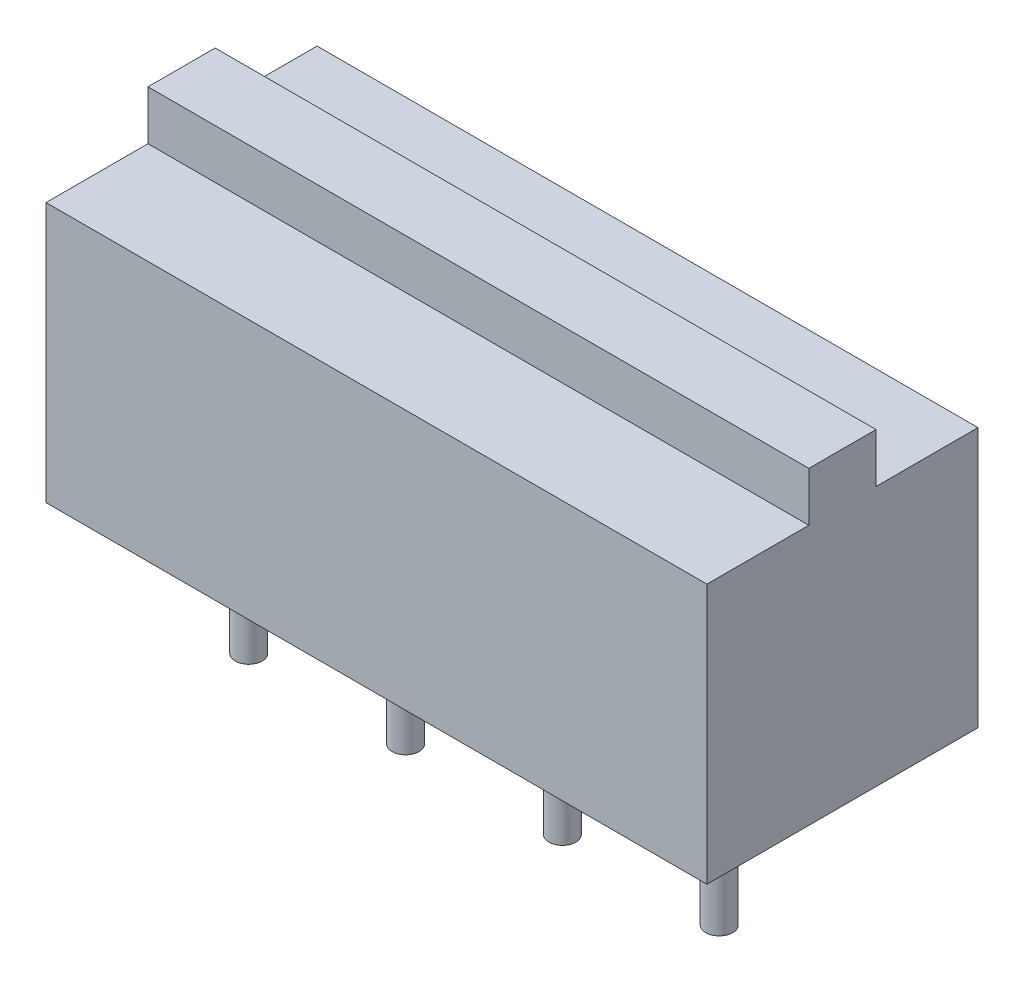
ISO-10303-21;
HEADER;
FILE_DESCRIPTION(('STEP AP214'),'2;1');
FILE_NAME('part.step','',(''),(''),'','','');
FILE_SCHEMA(('AUTOMOTIVE_DESIGN { 1 0 10303 214 1 1 1 1 }'));
ENDSEC;
DATA;
#1=APPLICATION_CONTEXT('core data for automotive mechanical design processes');
#2=APPLICATION_PROTOCOL_DEFINITION('international standard','automotive_design',2000,#1);
#3=PRODUCT_CONTEXT('',#1,'mechanical');
#4=PRODUCT('Part','Part','',(#3));
#5=PRODUCT_RELATED_PRODUCT_CATEGORY('part','',(#4));
#6=PRODUCT_DEFINITION_FORMATION('','',#4);
#7=PRODUCT_DEFINITION_CONTEXT('part definition',#1,'design');
#8=PRODUCT_DEFINITION('design','',#6,#7);
#9=PRODUCT_DEFINITION_SHAPE('','',#8);
#10=(LENGTH_UNIT() NAMED_UNIT(*) SI_UNIT(.MILLI.,.METRE.));
#11=(NAMED_UNIT(*) PLANE_ANGLE_UNIT() SI_UNIT($,.RADIAN.));
#12=(NAMED_UNIT(*) SI_UNIT($,.STERADIAN.) SOLID_ANGLE_UNIT());
#13=UNCERTAINTY_MEASURE_WITH_UNIT(LENGTH_MEASURE(1.E-05),#10,'distance_accuracy_value','');
#14=(GEOMETRIC_REPRESENTATION_CONTEXT(3) GLOBAL_UNCERTAINTY_ASSIGNED_CONTEXT((#13)) GLOBAL_UNIT_ASSIGNED_CONTEXT((#10,
#11,#12)) REPRESENTATION_CONTEXT('',''));
#15=CARTESIAN_POINT('',(0.,0.,0.));
#16=DIRECTION('',(0.,0.,1.));
#17=DIRECTION('',(1.,0.,0.));
#18=AXIS2_PLACEMENT_3D('',#15,#16,#17);
#19=CARTESIAN_POINT('',(0.,11.6,0.));
#20=DIRECTION('',(0.,-1.,0.));
#21=DIRECTION('',(0.,0.,-1.));
#22=AXIS2_PLACEMENT_3D('',#19,#20,#21);
#23=PLANE('',#22);
#24=DIRECTION('',(1.,0.,0.));
#25=VECTOR('',#24,1.);
#26=CARTESIAN_POINT('',(-14.75,11.6,1.5));
#27=LINE('',#26,#25);
#28=CARTESIAN_POINT('',(-14.75,11.6,1.5));
#29=VERTEX_POINT('',#28);
#30=CARTESIAN_POINT('',(14.75,11.6,1.5));
#31=VERTEX_POINT('',#30);
#32=EDGE_CURVE('E55',#29,#31,#27,.T.);
#33=ORIENTED_EDGE('',*,*,#32,.F.);
#34=DIRECTION('',(0.,0.,1.));
#35=VECTOR('',#34,1.);
#36=CARTESIAN_POINT('',(-14.75,11.6,6.05));
#37=LINE('',#36,#35);
#38=CARTESIAN_POINT('',(-14.75,11.6,6.05));
#39=VERTEX_POINT('',#38);
#40=EDGE_CURVE('E147',#29,#39,#37,.T.);
#41=ORIENTED_EDGE('',*,*,#40,.T.);
#42=DIRECTION('',(1.,0.,0.));
#43=VECTOR('',#42,1.);
#44=CARTESIAN_POINT('',(-14.75,11.6,6.05));
#45=LINE('',#44,#43);
#46=CARTESIAN_POINT('',(14.75,11.6,6.05));
#47=VERTEX_POINT('',#46);
#48=EDGE_CURVE('E151',#39,#47,#45,.T.);
#49=ORIENTED_EDGE('',*,*,#48,.T.);
#50=DIRECTION('',(0.,0.,-1.));
#51=VECTOR('',#50,1.);
#52=CARTESIAN_POINT('',(14.75,11.6,6.05));
#53=LINE('',#52,#51);
#54=EDGE_CURVE('E141',#47,#31,#53,.T.);
#55=ORIENTED_EDGE('',*,*,#54,.T.);
#56=EDGE_LOOP('',(#33,#41,#49,#55));
#57=FACE_BOUND('',#56,.T.);
#58=ADVANCED_FACE('F39',(#57),#23,.F.);
#59=DIRECTION('',(-1.,0.,0.));
#60=VECTOR('',#59,1.);
#61=CARTESIAN_POINT('',(-14.75,11.6,-1.5));
#62=LINE('',#61,#60);
#63=CARTESIAN_POINT('',(14.75,11.6,-1.5));
#64=VERTEX_POINT('',#63);
#65=CARTESIAN_POINT('',(-14.75,11.6,-1.5));
#66=VERTEX_POINT('',#65);
#67=EDGE_CURVE('E63',#64,#66,#62,.T.);
#68=ORIENTED_EDGE('',*,*,#67,.F.);
#69=CARTESIAN_POINT('',(14.75,11.6,-6.05));
#70=VERTEX_POINT('',#69);
#71=EDGE_CURVE('E129',#64,#70,#53,.T.);
#72=ORIENTED_EDGE('',*,*,#71,.T.);
#73=DIRECTION('',(-1.,0.,0.));
#74=VECTOR('',#73,1.);
#75=CARTESIAN_POINT('',(-14.75,11.6,-6.05));
#76=LINE('',#75,#74);
#77=CARTESIAN_POINT('',(-14.75,11.6,-6.05));
#78=VERTEX_POINT('',#77);
#79=EDGE_CURVE('E144',#70,#78,#76,.T.);
#80=ORIENTED_EDGE('',*,*,#79,.T.);
#81=EDGE_CURVE('E148',#78,#66,#37,.T.);
#82=ORIENTED_EDGE('',*,*,#81,.T.);
#83=EDGE_LOOP('',(#68,#72,#80,#82));
#84=FACE_BOUND('',#83,.T.);
#85=ADVANCED_FACE('F311',(#84),#23,.F.);
#86=CARTESIAN_POINT('',(14.75,11.6,6.05));
#87=DIRECTION('',(-1.,0.,0.));
#88=DIRECTION('',(0.,0.,1.));
#89=AXIS2_PLACEMENT_3D('',#86,#87,#88);
#90=PLANE('',#89);
#91=DIRECTION('',(0.,0.,-1.));
#92=VECTOR('',#91,1.);
#93=CARTESIAN_POINT('',(14.75,0.,6.05));
#94=LINE('',#93,#92);
#95=CARTESIAN_POINT('',(14.75,0.,6.05));
#96=VERTEX_POINT('',#95);
#97=CARTESIAN_POINT('',(14.75,0.,-6.05));
#98=VERTEX_POINT('',#97);
#99=EDGE_CURVE('E131',#96,#98,#94,.T.);
#100=ORIENTED_EDGE('',*,*,#99,.T.);
#101=DIRECTION('',(0.,-1.,0.));
#102=VECTOR('',#101,1.);
#103=CARTESIAN_POINT('',(14.75,11.6,-6.05));
#104=LINE('',#103,#102);
#105=EDGE_CURVE('E11',#70,#98,#104,.T.);
#106=ORIENTED_EDGE('',*,*,#105,.F.);
#107=ORIENTED_EDGE('',*,*,#71,.F.);
#108=DIRECTION('',(0.,-1.,0.));
#109=VECTOR('',#108,1.);
#110=CARTESIAN_POINT('',(14.75,13.8,-1.5));
#111=LINE('',#110,#109);
#112=CARTESIAN_POINT('',(14.75,13.8,-1.5));
#113=VERTEX_POINT('',#112);
#114=EDGE_CURVE('E109',#113,#64,#111,.T.);
#115=ORIENTED_EDGE('',*,*,#114,.F.);
#116=DIRECTION('',(0.,0.,-1.));
#117=VECTOR('',#116,1.);
#118=CARTESIAN_POINT('',(14.75,13.8,1.5));
#119=LINE('',#118,#117);
#120=CARTESIAN_POINT('',(14.75,13.8,1.5));
#121=VERTEX_POINT('',#120);
#122=EDGE_CURVE('E116',#121,#113,#119,.T.);
#123=ORIENTED_EDGE('',*,*,#122,.F.);
#124=DIRECTION('',(0.,-1.,0.));
#125=VECTOR('',#124,1.);
#126=CARTESIAN_POINT('',(14.75,13.8,1.5));
#127=LINE('',#126,#125);
#128=EDGE_CURVE('E188',#121,#31,#127,.T.);
#129=ORIENTED_EDGE('',*,*,#128,.T.);
#130=ORIENTED_EDGE('',*,*,#54,.F.);
#131=DIRECTION('',(0.,-1.,0.));
#132=VECTOR('',#131,1.);
#133=CARTESIAN_POINT('',(14.75,11.6,6.05));
#134=LINE('',#133,#132);
#135=EDGE_CURVE('E153',#47,#96,#134,.T.);
#136=ORIENTED_EDGE('',*,*,#135,.T.);
#137=EDGE_LOOP('',(#100,#106,#107,#115,#123,#129,#130,#136));
#138=FACE_BOUND('',#137,.T.);
#139=ADVANCED_FACE('F41',(#138),#90,.F.);
#140=CARTESIAN_POINT('',(-14.75,11.6,-6.05));
#141=DIRECTION('',(0.,0.,1.));
#142=DIRECTION('',(1.,0.,0.));
#143=AXIS2_PLACEMENT_3D('',#140,#141,#142);
#144=PLANE('',#143);
#145=DIRECTION('',(-1.,0.,0.));
#146=VECTOR('',#145,1.);
#147=CARTESIAN_POINT('',(-14.75,0.,-6.05));
#148=LINE('',#147,#146);
#149=CARTESIAN_POINT('',(-14.75,0.,-6.05));
#150=VERTEX_POINT('',#149);
#151=EDGE_CURVE('E135',#98,#150,#148,.T.);
#152=ORIENTED_EDGE('',*,*,#151,.T.);
#153=DIRECTION('',(0.,-1.,0.));
#154=VECTOR('',#153,1.);
#155=CARTESIAN_POINT('',(-14.75,11.6,-6.05));
#156=LINE('',#155,#154);
#157=EDGE_CURVE('E48',#78,#150,#156,.T.);
#158=ORIENTED_EDGE('',*,*,#157,.F.);
#159=ORIENTED_EDGE('',*,*,#79,.F.);
#160=ORIENTED_EDGE('',*,*,#105,.T.);
#161=EDGE_LOOP('',(#152,#158,#159,#160));
#162=FACE_BOUND('',#161,.T.);
#163=ADVANCED_FACE('F322',(#162),#144,.F.);
#164=CARTESIAN_POINT('',(-14.75,11.6,6.05));
#165=DIRECTION('',(1.,0.,0.));
#166=DIRECTION('',(0.,0.,-1.));
#167=AXIS2_PLACEMENT_3D('',#164,#165,#166);
#168=PLANE('',#167);
#169=DIRECTION('',(0.,0.,1.));
#170=VECTOR('',#169,1.);
#171=CARTESIAN_POINT('',(-14.75,0.,6.05));
#172=LINE('',#171,#170);
#173=CARTESIAN_POINT('',(-14.75,0.,6.05));
#174=VERTEX_POINT('',#173);
#175=EDGE_CURVE('E157',#150,#174,#172,.T.);
#176=ORIENTED_EDGE('',*,*,#175,.T.);
#177=DIRECTION('',(0.,-1.,0.));
#178=VECTOR('',#177,1.);
#179=CARTESIAN_POINT('',(-14.75,11.6,6.05));
#180=LINE('',#179,#178);
#181=EDGE_CURVE('E166',#39,#174,#180,.T.);
#182=ORIENTED_EDGE('',*,*,#181,.F.);
#183=ORIENTED_EDGE('',*,*,#40,.F.);
#184=DIRECTION('',(0.,-1.,0.));
#185=VECTOR('',#184,1.);
#186=CARTESIAN_POINT('',(-14.75,13.8,1.5));
#187=LINE('',#186,#185);
#188=CARTESIAN_POINT('',(-14.75,13.8,1.5));
#189=VERTEX_POINT('',#188);
#190=EDGE_CURVE('E137',#189,#29,#187,.T.);
#191=ORIENTED_EDGE('',*,*,#190,.F.);
#192=DIRECTION('',(0.,0.,1.));
#193=VECTOR('',#192,1.);
#194=CARTESIAN_POINT('',(-14.75,13.8,1.5));
#195=LINE('',#194,#193);
#196=CARTESIAN_POINT('',(-14.75,13.8,-1.5));
#197=VERTEX_POINT('',#196);
#198=EDGE_CURVE('E115',#197,#189,#195,.T.);
#199=ORIENTED_EDGE('',*,*,#198,.F.);
#200=DIRECTION('',(0.,-1.,0.));
#201=VECTOR('',#200,1.);
#202=CARTESIAN_POINT('',(-14.75,13.8,-1.5));
#203=LINE('',#202,#201);
#204=EDGE_CURVE('E111',#197,#66,#203,.T.);
#205=ORIENTED_EDGE('',*,*,#204,.T.);
#206=ORIENTED_EDGE('',*,*,#81,.F.);
#207=ORIENTED_EDGE('',*,*,#157,.T.);
#208=EDGE_LOOP('',(#176,#182,#183,#191,#199,#205,#206,#207));
#209=FACE_BOUND('',#208,.T.);
#210=ADVANCED_FACE('F175',(#209),#168,.F.);
#211=CARTESIAN_POINT('',(-14.75,11.6,6.05));
#212=DIRECTION('',(0.,0.,-1.));
#213=DIRECTION('',(-1.,0.,0.));
#214=AXIS2_PLACEMENT_3D('',#211,#212,#213);
#215=PLANE('',#214);
#216=DIRECTION('',(1.,0.,0.));
#217=VECTOR('',#216,1.);
#218=CARTESIAN_POINT('',(-14.75,0.,6.05));
#219=LINE('',#218,#217);
#220=EDGE_CURVE('E160',#174,#96,#219,.T.);
#221=ORIENTED_EDGE('',*,*,#220,.T.);
#222=ORIENTED_EDGE('',*,*,#135,.F.);
#223=ORIENTED_EDGE('',*,*,#48,.F.);
#224=ORIENTED_EDGE('',*,*,#181,.T.);
#225=EDGE_LOOP('',(#221,#222,#223,#224));
#226=FACE_BOUND('',#225,.T.);
#227=ADVANCED_FACE('F185',(#226),#215,.F.);
#228=CARTESIAN_POINT('',(0.,0.,0.));
#229=DIRECTION('',(0.,-1.,0.));
#230=DIRECTION('',(0.,0.,-1.));
#231=AXIS2_PLACEMENT_3D('',#228,#229,#230);
#232=PLANE('',#231);
#233=CARTESIAN_POINT('',(13.,0.,3.75));
#234=DIRECTION('',(0.,-1.,0.));
#235=DIRECTION('',(0.,0.,-1.));
#236=AXIS2_PLACEMENT_3D('',#233,#234,#235);
#237=CIRCLE('',#236,0.6);
#238=CARTESIAN_POINT('',(13.,0.,3.15));
#239=VERTEX_POINT('',#238);
#240=EDGE_CURVE('E262',#239,#239,#237,.T.);
#241=ORIENTED_EDGE('',*,*,#240,.F.);
#242=EDGE_LOOP('',(#241));
#243=FACE_BOUND('',#242,.T.);
#244=CARTESIAN_POINT('',(9.50000000000002,0.,-1.35));
#245=DIRECTION('',(0.,-1.,0.));
#246=DIRECTION('',(0.,0.,-1.));
#247=AXIS2_PLACEMENT_3D('',#244,#245,#246);
#248=CIRCLE('',#247,0.6);
#249=CARTESIAN_POINT('',(9.50000000000002,0.,-1.95));
#250=VERTEX_POINT('',#249);
#251=EDGE_CURVE('E254',#250,#250,#248,.T.);
#252=ORIENTED_EDGE('',*,*,#251,.F.);
#253=EDGE_LOOP('',(#252));
#254=FACE_BOUND('',#253,.T.);
#255=CARTESIAN_POINT('',(6.00000000000002,0.,3.75));
#256=DIRECTION('',(0.,-1.,0.));
#257=DIRECTION('',(0.,0.,-1.));
#258=AXIS2_PLACEMENT_3D('',#255,#256,#257);
#259=CIRCLE('',#258,0.6);
#260=CARTESIAN_POINT('',(6.00000000000002,0.,3.15));
#261=VERTEX_POINT('',#260);
#262=EDGE_CURVE('E246',#261,#261,#259,.T.);
#263=ORIENTED_EDGE('',*,*,#262,.F.);
#264=EDGE_LOOP('',(#263));
#265=FACE_BOUND('',#264,.T.);
#266=CARTESIAN_POINT('',(2.50000000000002,0.,-1.35));
#267=DIRECTION('',(0.,-1.,0.));
#268=DIRECTION('',(0.,0.,-1.));
#269=AXIS2_PLACEMENT_3D('',#266,#267,#268);
#270=CIRCLE('',#269,0.6);
#271=CARTESIAN_POINT('',(2.50000000000002,0.,-1.95));
#272=VERTEX_POINT('',#271);
#273=EDGE_CURVE('E238',#272,#272,#270,.T.);
#274=ORIENTED_EDGE('',*,*,#273,.F.);
#275=EDGE_LOOP('',(#274));
#276=FACE_BOUND('',#275,.T.);
#277=CARTESIAN_POINT('',(-0.999999999999979,0.,3.75));
#278=DIRECTION('',(0.,-1.,0.));
#279=DIRECTION('',(0.,0.,-1.));
#280=AXIS2_PLACEMENT_3D('',#277,#278,#279);
#281=CIRCLE('',#280,0.6);
#282=CARTESIAN_POINT('',(-0.999999999999979,0.,3.15));
#283=VERTEX_POINT('',#282);
#284=EDGE_CURVE('E230',#283,#283,#281,.T.);
#285=ORIENTED_EDGE('',*,*,#284,.F.);
#286=EDGE_LOOP('',(#285));
#287=FACE_BOUND('',#286,.T.);
#288=CARTESIAN_POINT('',(-4.49999999999998,0.,-1.35));
#289=DIRECTION('',(0.,-1.,0.));
#290=DIRECTION('',(0.,0.,-1.));
#291=AXIS2_PLACEMENT_3D('',#288,#289,#290);
#292=CIRCLE('',#291,0.6);
#293=CARTESIAN_POINT('',(-4.49999999999998,0.,-1.95));
#294=VERTEX_POINT('',#293);
#295=EDGE_CURVE('E222',#294,#294,#292,.T.);
#296=ORIENTED_EDGE('',*,*,#295,.F.);
#297=EDGE_LOOP('',(#296));
#298=FACE_BOUND('',#297,.T.);
#299=CARTESIAN_POINT('',(-7.99999999999998,0.,3.75));
#300=DIRECTION('',(0.,-1.,0.));
#301=DIRECTION('',(0.,0.,-1.));
#302=AXIS2_PLACEMENT_3D('',#299,#300,#301);
#303=CIRCLE('',#302,0.6);
#304=CARTESIAN_POINT('',(-7.99999999999998,0.,3.15));
#305=VERTEX_POINT('',#304);
#306=EDGE_CURVE('E214',#305,#305,#303,.T.);
#307=ORIENTED_EDGE('',*,*,#306,.F.);
#308=EDGE_LOOP('',(#307));
#309=FACE_BOUND('',#308,.T.);
#310=CARTESIAN_POINT('',(-11.5,0.,-1.35));
#311=DIRECTION('',(0.,-1.,0.));
#312=DIRECTION('',(0.,0.,-1.));
#313=AXIS2_PLACEMENT_3D('',#310,#311,#312);
#314=CIRCLE('',#313,0.6);
#315=CARTESIAN_POINT('',(-11.5,0.,-1.95));
#316=VERTEX_POINT('',#315);
#317=EDGE_CURVE('E206',#316,#316,#314,.T.);
#318=ORIENTED_EDGE('',*,*,#317,.F.);
#319=EDGE_LOOP('',(#318));
#320=FACE_BOUND('',#319,.T.);
#321=ORIENTED_EDGE('',*,*,#99,.F.);
#322=ORIENTED_EDGE('',*,*,#220,.F.);
#323=ORIENTED_EDGE('',*,*,#175,.F.);
#324=ORIENTED_EDGE('',*,*,#151,.F.);
#325=EDGE_LOOP('',(#321,#322,#323,#324));
#326=FACE_BOUND('',#325,.T.);
#327=ADVANCED_FACE('F182',(#243,#254,#265,#276,#287,#298,#309,#320,#326),#232,.T.);
#328=CARTESIAN_POINT('',(-14.75,13.8,-1.5));
#329=DIRECTION('',(0.,0.,1.));
#330=DIRECTION('',(1.,0.,0.));
#331=AXIS2_PLACEMENT_3D('',#328,#329,#330);
#332=PLANE('',#331);
#333=ORIENTED_EDGE('',*,*,#67,.T.);
#334=ORIENTED_EDGE('',*,*,#204,.F.);
#335=DIRECTION('',(-1.,0.,0.));
#336=VECTOR('',#335,1.);
#337=CARTESIAN_POINT('',(-14.75,13.8,-1.5));
#338=LINE('',#337,#336);
#339=EDGE_CURVE('E105',#113,#197,#338,.T.);
#340=ORIENTED_EDGE('',*,*,#339,.F.);
#341=ORIENTED_EDGE('',*,*,#114,.T.);
#342=EDGE_LOOP('',(#333,#334,#340,#341));
#343=FACE_BOUND('',#342,.T.);
#344=ADVANCED_FACE('F107',(#343),#332,.F.);
#345=CARTESIAN_POINT('',(-14.75,13.8,1.5));
#346=DIRECTION('',(0.,0.,-1.));
#347=DIRECTION('',(-1.,0.,0.));
#348=AXIS2_PLACEMENT_3D('',#345,#346,#347);
#349=PLANE('',#348);
#350=ORIENTED_EDGE('',*,*,#32,.T.);
#351=ORIENTED_EDGE('',*,*,#128,.F.);
#352=DIRECTION('',(1.,0.,0.));
#353=VECTOR('',#352,1.);
#354=CARTESIAN_POINT('',(-14.75,13.8,1.5));
#355=LINE('',#354,#353);
#356=EDGE_CURVE('E121',#189,#121,#355,.T.);
#357=ORIENTED_EDGE('',*,*,#356,.F.);
#358=ORIENTED_EDGE('',*,*,#190,.T.);
#359=EDGE_LOOP('',(#350,#351,#357,#358));
#360=FACE_BOUND('',#359,.T.);
#361=ADVANCED_FACE('F191',(#360),#349,.F.);
#362=CARTESIAN_POINT('',(0.,13.8,0.));
#363=DIRECTION('',(0.,-1.,0.));
#364=DIRECTION('',(0.,0.,-1.));
#365=AXIS2_PLACEMENT_3D('',#362,#363,#364);
#366=PLANE('',#365);
#367=ORIENTED_EDGE('',*,*,#122,.T.);
#368=ORIENTED_EDGE('',*,*,#339,.T.);
#369=ORIENTED_EDGE('',*,*,#198,.T.);
#370=ORIENTED_EDGE('',*,*,#356,.T.);
#371=EDGE_LOOP('',(#367,#368,#369,#370));
#372=FACE_BOUND('',#371,.T.);
#373=ADVANCED_FACE('F119',(#372),#366,.F.);
#374=CARTESIAN_POINT('',(-11.5,-3.6,-1.35));
#375=DIRECTION('',(0.,1.,0.));
#376=DIRECTION('',(0.,0.,1.));
#377=AXIS2_PLACEMENT_3D('',#374,#375,#376);
#378=CYLINDRICAL_SURFACE('',#377,0.6);
#379=CARTESIAN_POINT('',(-11.5,-3.6,-1.35));
#380=DIRECTION('',(0.,-1.,0.));
#381=DIRECTION('',(0.,0.,-1.));
#382=AXIS2_PLACEMENT_3D('',#379,#380,#381);
#383=CIRCLE('',#382,0.6);
#384=CARTESIAN_POINT('',(-11.5,-3.6,-1.95));
#385=VERTEX_POINT('',#384);
#386=EDGE_CURVE('E196',#385,#385,#383,.T.);
#387=ORIENTED_EDGE('',*,*,#386,.F.);
#388=EDGE_LOOP('',(#387));
#389=FACE_BOUND('',#388,.T.);
#390=ORIENTED_EDGE('',*,*,#317,.T.);
#391=EDGE_LOOP('',(#390));
#392=FACE_BOUND('',#391,.T.);
#393=ADVANCED_FACE('F296',(#389,#392),#378,.T.);
#394=CARTESIAN_POINT('',(-11.5,-3.6,-1.35));
#395=DIRECTION('',(0.,-1.,0.));
#396=DIRECTION('',(0.,0.,-1.));
#397=AXIS2_PLACEMENT_3D('',#394,#395,#396);
#398=PLANE('',#397);
#399=ORIENTED_EDGE('',*,*,#386,.T.);
#400=EDGE_LOOP('',(#399));
#401=FACE_BOUND('',#400,.T.);
#402=ADVANCED_FACE('F298',(#401),#398,.T.);
#403=CARTESIAN_POINT('',(-7.99999999999998,-3.6,3.75));
#404=DIRECTION('',(0.,1.,0.));
#405=DIRECTION('',(0.,0.,1.));
#406=AXIS2_PLACEMENT_3D('',#403,#404,#405);
#407=CYLINDRICAL_SURFACE('',#406,0.6);
#408=CARTESIAN_POINT('',(-7.99999999999998,-3.6,3.75));
#409=DIRECTION('',(0.,-1.,0.));
#410=DIRECTION('',(0.,0.,-1.));
#411=AXIS2_PLACEMENT_3D('',#408,#409,#410);
#412=CIRCLE('',#411,0.6);
#413=CARTESIAN_POINT('',(-7.99999999999998,-3.6,3.15));
#414=VERTEX_POINT('',#413);
#415=EDGE_CURVE('E210',#414,#414,#412,.T.);
#416=ORIENTED_EDGE('',*,*,#415,.F.);
#417=EDGE_LOOP('',(#416));
#418=FACE_BOUND('',#417,.T.);
#419=ORIENTED_EDGE('',*,*,#306,.T.);
#420=EDGE_LOOP('',(#419));
#421=FACE_BOUND('',#420,.T.);
#422=ADVANCED_FACE('F305',(#418,#421),#407,.T.);
#423=CARTESIAN_POINT('',(-7.99999999999998,-3.6,3.75));
#424=DIRECTION('',(0.,-1.,0.));
#425=DIRECTION('',(0.,0.,-1.));
#426=AXIS2_PLACEMENT_3D('',#423,#424,#425);
#427=PLANE('',#426);
#428=ORIENTED_EDGE('',*,*,#415,.T.);
#429=EDGE_LOOP('',(#428));
#430=FACE_BOUND('',#429,.T.);
#431=ADVANCED_FACE('F400',(#430),#427,.T.);
#432=CARTESIAN_POINT('',(-4.49999999999998,-3.6,-1.35));
#433=DIRECTION('',(0.,1.,0.));
#434=DIRECTION('',(0.,0.,1.));
#435=AXIS2_PLACEMENT_3D('',#432,#433,#434);
#436=CYLINDRICAL_SURFACE('',#435,0.6);
#437=CARTESIAN_POINT('',(-4.49999999999998,-3.6,-1.35));
#438=DIRECTION('',(0.,-1.,0.));
#439=DIRECTION('',(0.,0.,-1.));
#440=AXIS2_PLACEMENT_3D('',#437,#438,#439);
#441=CIRCLE('',#440,0.6);
#442=CARTESIAN_POINT('',(-4.49999999999998,-3.6,-1.95));
#443=VERTEX_POINT('',#442);
#444=EDGE_CURVE('E218',#443,#443,#441,.T.);
#445=ORIENTED_EDGE('',*,*,#444,.F.);
#446=EDGE_LOOP('',(#445));
#447=FACE_BOUND('',#446,.T.);
#448=ORIENTED_EDGE('',*,*,#295,.T.);
#449=EDGE_LOOP('',(#448));
#450=FACE_BOUND('',#449,.T.);
#451=ADVANCED_FACE('F409',(#447,#450),#436,.T.);
#452=CARTESIAN_POINT('',(-4.49999999999998,-3.6,-1.35));
#453=DIRECTION('',(0.,-1.,0.));
#454=DIRECTION('',(0.,0.,-1.));
#455=AXIS2_PLACEMENT_3D('',#452,#453,#454);
#456=PLANE('',#455);
#457=ORIENTED_EDGE('',*,*,#444,.T.);
#458=EDGE_LOOP('',(#457));
#459=FACE_BOUND('',#458,.T.);
#460=ADVANCED_FACE('F418',(#459),#456,.T.);
#461=CARTESIAN_POINT('',(-0.999999999999979,-3.6,3.75));
#462=DIRECTION('',(0.,1.,0.));
#463=DIRECTION('',(0.,0.,1.));
#464=AXIS2_PLACEMENT_3D('',#461,#462,#463);
#465=CYLINDRICAL_SURFACE('',#464,0.6);
#466=CARTESIAN_POINT('',(-0.999999999999979,-3.6,3.75));
#467=DIRECTION('',(0.,-1.,0.));
#468=DIRECTION('',(0.,0.,-1.));
#469=AXIS2_PLACEMENT_3D('',#466,#467,#468);
#470=CIRCLE('',#469,0.6);
#471=CARTESIAN_POINT('',(-0.999999999999979,-3.6,3.15));
#472=VERTEX_POINT('',#471);
#473=EDGE_CURVE('E226',#472,#472,#470,.T.);
#474=ORIENTED_EDGE('',*,*,#473,.F.);
#475=EDGE_LOOP('',(#474));
#476=FACE_BOUND('',#475,.T.);
#477=ORIENTED_EDGE('',*,*,#284,.T.);
#478=EDGE_LOOP('',(#477));
#479=FACE_BOUND('',#478,.T.);
#480=ADVANCED_FACE('F427',(#476,#479),#465,.T.);
#481=CARTESIAN_POINT('',(-0.999999999999979,-3.6,3.75));
#482=DIRECTION('',(0.,-1.,0.));
#483=DIRECTION('',(0.,0.,-1.));
#484=AXIS2_PLACEMENT_3D('',#481,#482,#483);
#485=PLANE('',#484);
#486=ORIENTED_EDGE('',*,*,#473,.T.);
#487=EDGE_LOOP('',(#486));
#488=FACE_BOUND('',#487,.T.);
#489=ADVANCED_FACE('F436',(#488),#485,.T.);
#490=CARTESIAN_POINT('',(2.50000000000002,-3.6,-1.35));
#491=DIRECTION('',(0.,1.,0.));
#492=DIRECTION('',(0.,0.,1.));
#493=AXIS2_PLACEMENT_3D('',#490,#491,#492);
#494=CYLINDRICAL_SURFACE('',#493,0.6);
#495=CARTESIAN_POINT('',(2.50000000000002,-3.6,-1.35));
#496=DIRECTION('',(0.,-1.,0.));
#497=DIRECTION('',(0.,0.,-1.));
#498=AXIS2_PLACEMENT_3D('',#495,#496,#497);
#499=CIRCLE('',#498,0.6);
#500=CARTESIAN_POINT('',(2.50000000000002,-3.6,-1.95));
#501=VERTEX_POINT('',#500);
#502=EDGE_CURVE('E234',#501,#501,#499,.T.);
#503=ORIENTED_EDGE('',*,*,#502,.F.);
#504=EDGE_LOOP('',(#503));
#505=FACE_BOUND('',#504,.T.);
#506=ORIENTED_EDGE('',*,*,#273,.T.);
#507=EDGE_LOOP('',(#506));
#508=FACE_BOUND('',#507,.T.);
#509=ADVANCED_FACE('F445',(#505,#508),#494,.T.);
#510=CARTESIAN_POINT('',(2.50000000000002,-3.6,-1.35));
#511=DIRECTION('',(0.,-1.,0.));
#512=DIRECTION('',(0.,0.,-1.));
#513=AXIS2_PLACEMENT_3D('',#510,#511,#512);
#514=PLANE('',#513);
#515=ORIENTED_EDGE('',*,*,#502,.T.);
#516=EDGE_LOOP('',(#515));
#517=FACE_BOUND('',#516,.T.);
#518=ADVANCED_FACE('F454',(#517),#514,.T.);
#519=CARTESIAN_POINT('',(6.00000000000002,-3.6,3.75));
#520=DIRECTION('',(0.,1.,0.));
#521=DIRECTION('',(0.,0.,1.));
#522=AXIS2_PLACEMENT_3D('',#519,#520,#521);
#523=CYLINDRICAL_SURFACE('',#522,0.6);
#524=CARTESIAN_POINT('',(6.00000000000002,-3.6,3.75));
#525=DIRECTION('',(0.,-1.,0.));
#526=DIRECTION('',(0.,0.,-1.));
#527=AXIS2_PLACEMENT_3D('',#524,#525,#526);
#528=CIRCLE('',#527,0.6);
#529=CARTESIAN_POINT('',(6.00000000000002,-3.6,3.15));
#530=VERTEX_POINT('',#529);
#531=EDGE_CURVE('E242',#530,#530,#528,.T.);
#532=ORIENTED_EDGE('',*,*,#531,.F.);
#533=EDGE_LOOP('',(#532));
#534=FACE_BOUND('',#533,.T.);
#535=ORIENTED_EDGE('',*,*,#262,.T.);
#536=EDGE_LOOP('',(#535));
#537=FACE_BOUND('',#536,.T.);
#538=ADVANCED_FACE('F463',(#534,#537),#523,.T.);
#539=CARTESIAN_POINT('',(6.00000000000002,-3.6,3.75));
#540=DIRECTION('',(0.,-1.,0.));
#541=DIRECTION('',(0.,0.,-1.));
#542=AXIS2_PLACEMENT_3D('',#539,#540,#541);
#543=PLANE('',#542);
#544=ORIENTED_EDGE('',*,*,#531,.T.);
#545=EDGE_LOOP('',(#544));
#546=FACE_BOUND('',#545,.T.);
#547=ADVANCED_FACE('F472',(#546),#543,.T.);
#548=CARTESIAN_POINT('',(9.50000000000002,-3.6,-1.35));
#549=DIRECTION('',(0.,1.,0.));
#550=DIRECTION('',(0.,0.,1.));
#551=AXIS2_PLACEMENT_3D('',#548,#549,#550);
#552=CYLINDRICAL_SURFACE('',#551,0.6);
#553=CARTESIAN_POINT('',(9.50000000000002,-3.6,-1.35));
#554=DIRECTION('',(0.,-1.,0.));
#555=DIRECTION('',(0.,0.,-1.));
#556=AXIS2_PLACEMENT_3D('',#553,#554,#555);
#557=CIRCLE('',#556,0.6);
#558=CARTESIAN_POINT('',(9.50000000000002,-3.6,-1.95));
#559=VERTEX_POINT('',#558);
#560=EDGE_CURVE('E250',#559,#559,#557,.T.);
#561=ORIENTED_EDGE('',*,*,#560,.F.);
#562=EDGE_LOOP('',(#561));
#563=FACE_BOUND('',#562,.T.);
#564=ORIENTED_EDGE('',*,*,#251,.T.);
#565=EDGE_LOOP('',(#564));
#566=FACE_BOUND('',#565,.T.);
#567=ADVANCED_FACE('F481',(#563,#566),#552,.T.);
#568=CARTESIAN_POINT('',(9.50000000000002,-3.6,-1.35));
#569=DIRECTION('',(0.,-1.,0.));
#570=DIRECTION('',(0.,0.,-1.));
#571=AXIS2_PLACEMENT_3D('',#568,#569,#570);
#572=PLANE('',#571);
#573=ORIENTED_EDGE('',*,*,#560,.T.);
#574=EDGE_LOOP('',(#573));
#575=FACE_BOUND('',#574,.T.);
#576=ADVANCED_FACE('F275',(#575),#572,.T.);
#577=CARTESIAN_POINT('',(13.,-3.6,3.75));
#578=DIRECTION('',(0.,1.,0.));
#579=DIRECTION('',(0.,0.,1.));
#580=AXIS2_PLACEMENT_3D('',#577,#578,#579);
#581=CYLINDRICAL_SURFACE('',#580,0.6);
#582=CARTESIAN_POINT('',(13.,-3.6,3.75));
#583=DIRECTION('',(0.,-1.,0.));
#584=DIRECTION('',(0.,0.,-1.));
#585=AXIS2_PLACEMENT_3D('',#582,#583,#584);
#586=CIRCLE('',#585,0.6);
#587=CARTESIAN_POINT('',(13.,-3.6,3.15));
#588=VERTEX_POINT('',#587);
#589=EDGE_CURVE('E258',#588,#588,#586,.T.);
#590=ORIENTED_EDGE('',*,*,#589,.F.);
#591=EDGE_LOOP('',(#590));
#592=FACE_BOUND('',#591,.T.);
#593=ORIENTED_EDGE('',*,*,#240,.T.);
#594=EDGE_LOOP('',(#593));
#595=FACE_BOUND('',#594,.T.);
#596=ADVANCED_FACE('F272',(#592,#595),#581,.T.);
#597=CARTESIAN_POINT('',(13.,-3.6,3.75));
#598=DIRECTION('',(0.,-1.,0.));
#599=DIRECTION('',(0.,0.,-1.));
#600=AXIS2_PLACEMENT_3D('',#597,#598,#599);
#601=PLANE('',#600);
#602=ORIENTED_EDGE('',*,*,#589,.T.);
#603=EDGE_LOOP('',(#602));
#604=FACE_BOUND('',#603,.T.);
#605=ADVANCED_FACE('F270',(#604),#601,.T.);
#606=CLOSED_SHELL('',(#58,#85,#139,#163,#210,#227,#327,#344,#361,#373,#393,#402,#422,#431,#451,
#460,#480,#489,#509,#518,#538,#547,#567,#576,#596,#605));
#607=MANIFOLD_SOLID_BREP('B2',#606);
#608=ADVANCED_BREP_SHAPE_REPRESENTATION('',(#18,#607),#14);
#609=SHAPE_DEFINITION_REPRESENTATION(#9,#608);
ENDSEC;
END-ISO-10303-21;
